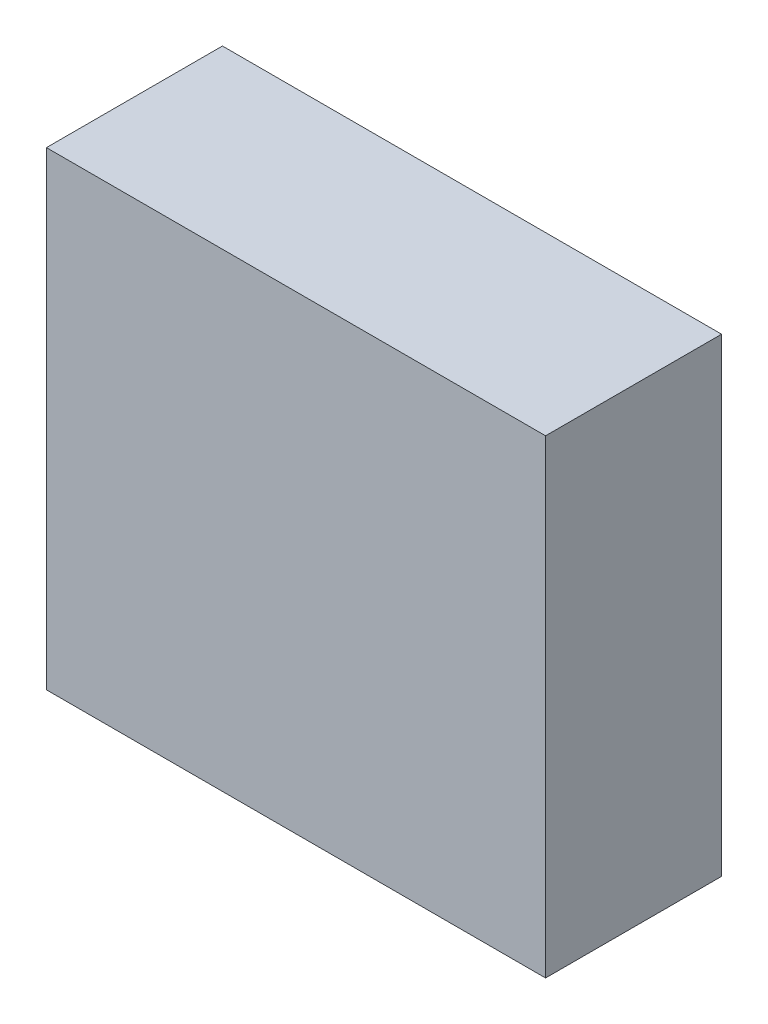
ISO-10303-21;
HEADER;
FILE_DESCRIPTION(('STEP AP214'),'2;1');
FILE_NAME('part.step','',(''),(''),'','','');
FILE_SCHEMA(('AUTOMOTIVE_DESIGN { 1 0 10303 214 1 1 1 1 }'));
ENDSEC;
DATA;
#1=APPLICATION_CONTEXT('core data for automotive mechanical design processes');
#2=APPLICATION_PROTOCOL_DEFINITION('international standard','automotive_design',2000,#1);
#3=PRODUCT_CONTEXT('',#1,'mechanical');
#4=PRODUCT('Part','Part','',(#3));
#5=PRODUCT_RELATED_PRODUCT_CATEGORY('part','',(#4));
#6=PRODUCT_DEFINITION_FORMATION('','',#4);
#7=PRODUCT_DEFINITION_CONTEXT('part definition',#1,'design');
#8=PRODUCT_DEFINITION('design','',#6,#7);
#9=PRODUCT_DEFINITION_SHAPE('','',#8);
#10=(LENGTH_UNIT() NAMED_UNIT(*) SI_UNIT(.MILLI.,.METRE.));
#11=(NAMED_UNIT(*) PLANE_ANGLE_UNIT() SI_UNIT($,.RADIAN.));
#12=(NAMED_UNIT(*) SI_UNIT($,.STERADIAN.) SOLID_ANGLE_UNIT());
#13=UNCERTAINTY_MEASURE_WITH_UNIT(LENGTH_MEASURE(1.E-05),#10,'distance_accuracy_value','');
#14=(GEOMETRIC_REPRESENTATION_CONTEXT(3) GLOBAL_UNCERTAINTY_ASSIGNED_CONTEXT((#13)) GLOBAL_UNIT_ASSIGNED_CONTEXT((#10,
#11,#12)) REPRESENTATION_CONTEXT('',''));
#15=CARTESIAN_POINT('',(0.,0.,0.));
#16=DIRECTION('',(0.,0.,1.));
#17=DIRECTION('',(1.,0.,0.));
#18=AXIS2_PLACEMENT_3D('',#15,#16,#17);
#19=CARTESIAN_POINT('',(-3.3749996,-3.175,2.38000032));
#20=DIRECTION('',(0.,0.,-1.));
#21=DIRECTION('',(-1.,0.,0.));
#22=AXIS2_PLACEMENT_3D('',#19,#20,#21);
#23=PLANE('',#22);
#24=DIRECTION('',(0.,1.,0.));
#25=VECTOR('',#24,1.);
#26=CARTESIAN_POINT('',(3.3749996,-3.175,2.38000032));
#27=LINE('',#26,#25);
#28=CARTESIAN_POINT('',(3.3749996,-3.175,2.38000032));
#29=VERTEX_POINT('',#28);
#30=CARTESIAN_POINT('',(3.3749996,3.17500254,2.38000032));
#31=VERTEX_POINT('',#30);
#32=EDGE_CURVE('E55',#29,#31,#27,.T.);
#33=ORIENTED_EDGE('',*,*,#32,.T.);
#34=DIRECTION('',(1.,0.,0.));
#35=VECTOR('',#34,1.);
#36=CARTESIAN_POINT('',(3.3749996,3.17500254,2.38000032));
#37=LINE('',#36,#35);
#38=CARTESIAN_POINT('',(-3.3749996,3.17500254,2.38000032));
#39=VERTEX_POINT('',#38);
#40=EDGE_CURVE('E57',#31,#39,#37,.F.);
#41=ORIENTED_EDGE('',*,*,#40,.T.);
#42=DIRECTION('',(0.,1.,0.));
#43=VECTOR('',#42,1.);
#44=CARTESIAN_POINT('',(-3.3749996,3.17500254,2.38000032));
#45=LINE('',#44,#43);
#46=CARTESIAN_POINT('',(-3.3749996,-3.175,2.38000032));
#47=VERTEX_POINT('',#46);
#48=EDGE_CURVE('E20',#39,#47,#45,.F.);
#49=ORIENTED_EDGE('',*,*,#48,.T.);
#50=DIRECTION('',(1.,0.,0.));
#51=VECTOR('',#50,1.);
#52=CARTESIAN_POINT('',(-3.3749996,-3.175,2.38000032));
#53=LINE('',#52,#51);
#54=EDGE_CURVE('E80',#47,#29,#53,.T.);
#55=ORIENTED_EDGE('',*,*,#54,.T.);
#56=EDGE_LOOP('',(#33,#41,#49,#55));
#57=FACE_BOUND('',#56,.T.);
#58=ADVANCED_FACE('F17',(#57),#23,.F.);
#59=CARTESIAN_POINT('',(-3.3749996,3.17500254,0.));
#60=DIRECTION('',(1.,0.,0.));
#61=DIRECTION('',(0.,0.,-1.));
#62=AXIS2_PLACEMENT_3D('',#59,#60,#61);
#63=PLANE('',#62);
#64=DIRECTION('',(0.,0.,1.));
#65=VECTOR('',#64,1.);
#66=CARTESIAN_POINT('',(-3.3749996,-3.175,0.));
#67=LINE('',#66,#65);
#68=CARTESIAN_POINT('',(-3.3749996,-3.175,0.));
#69=VERTEX_POINT('',#68);
#70=EDGE_CURVE('E68',#69,#47,#67,.T.);
#71=ORIENTED_EDGE('',*,*,#70,.T.);
#72=ORIENTED_EDGE('',*,*,#48,.F.);
#73=DIRECTION('',(0.,0.,-1.));
#74=VECTOR('',#73,1.);
#75=CARTESIAN_POINT('',(-3.3749996,3.17500254,0.));
#76=LINE('',#75,#74);
#77=CARTESIAN_POINT('',(-3.3749996,3.17500254,0.));
#78=VERTEX_POINT('',#77);
#79=EDGE_CURVE('E63',#39,#78,#76,.T.);
#80=ORIENTED_EDGE('',*,*,#79,.T.);
#81=DIRECTION('',(0.,1.,0.));
#82=VECTOR('',#81,1.);
#83=CARTESIAN_POINT('',(-3.3749996,-3.175,0.));
#84=LINE('',#83,#82);
#85=EDGE_CURVE('E83',#69,#78,#84,.T.);
#86=ORIENTED_EDGE('',*,*,#85,.F.);
#87=EDGE_LOOP('',(#71,#72,#80,#86));
#88=FACE_BOUND('',#87,.T.);
#89=ADVANCED_FACE('F65',(#88),#63,.F.);
#90=CARTESIAN_POINT('',(3.3749996,3.17500254,0.));
#91=DIRECTION('',(0.,-1.,0.));
#92=DIRECTION('',(0.,0.,-1.));
#93=AXIS2_PLACEMENT_3D('',#90,#91,#92);
#94=PLANE('',#93);
#95=ORIENTED_EDGE('',*,*,#79,.F.);
#96=ORIENTED_EDGE('',*,*,#40,.F.);
#97=DIRECTION('',(0.,0.,1.));
#98=VECTOR('',#97,1.);
#99=CARTESIAN_POINT('',(3.3749996,3.17500254,0.));
#100=LINE('',#99,#98);
#101=CARTESIAN_POINT('',(3.3749996,3.17500254,0.));
#102=VERTEX_POINT('',#101);
#103=EDGE_CURVE('E75',#31,#102,#100,.F.);
#104=ORIENTED_EDGE('',*,*,#103,.T.);
#105=DIRECTION('',(-1.,0.,0.));
#106=VECTOR('',#105,1.);
#107=CARTESIAN_POINT('',(-3.3749996,3.17500254,0.));
#108=LINE('',#107,#106);
#109=EDGE_CURVE('E72',#78,#102,#108,.F.);
#110=ORIENTED_EDGE('',*,*,#109,.F.);
#111=EDGE_LOOP('',(#95,#96,#104,#110));
#112=FACE_BOUND('',#111,.T.);
#113=ADVANCED_FACE('F70',(#112),#94,.F.);
#114=CARTESIAN_POINT('',(3.3749996,-3.175,0.));
#115=DIRECTION('',(-1.,0.,0.));
#116=DIRECTION('',(0.,0.,1.));
#117=AXIS2_PLACEMENT_3D('',#114,#115,#116);
#118=PLANE('',#117);
#119=ORIENTED_EDGE('',*,*,#103,.F.);
#120=ORIENTED_EDGE('',*,*,#32,.F.);
#121=DIRECTION('',(0.,0.,1.));
#122=VECTOR('',#121,1.);
#123=CARTESIAN_POINT('',(3.3749996,-3.175,0.));
#124=LINE('',#123,#122);
#125=CARTESIAN_POINT('',(3.3749996,-3.175,0.));
#126=VERTEX_POINT('',#125);
#127=EDGE_CURVE('E35',#29,#126,#124,.F.);
#128=ORIENTED_EDGE('',*,*,#127,.T.);
#129=DIRECTION('',(0.,1.,0.));
#130=VECTOR('',#129,1.);
#131=CARTESIAN_POINT('',(3.3749996,-3.175,0.));
#132=LINE('',#131,#130);
#133=EDGE_CURVE('E26',#102,#126,#132,.F.);
#134=ORIENTED_EDGE('',*,*,#133,.F.);
#135=EDGE_LOOP('',(#119,#120,#128,#134));
#136=FACE_BOUND('',#135,.T.);
#137=ADVANCED_FACE('F89',(#136),#118,.F.);
#138=CARTESIAN_POINT('',(-3.3749996,-3.175,0.));
#139=DIRECTION('',(0.,1.,0.));
#140=DIRECTION('',(0.,0.,1.));
#141=AXIS2_PLACEMENT_3D('',#138,#139,#140);
#142=PLANE('',#141);
#143=ORIENTED_EDGE('',*,*,#127,.F.);
#144=ORIENTED_EDGE('',*,*,#54,.F.);
#145=ORIENTED_EDGE('',*,*,#70,.F.);
#146=DIRECTION('',(-1.,0.,0.));
#147=VECTOR('',#146,1.);
#148=CARTESIAN_POINT('',(-3.3749996,-3.175,0.));
#149=LINE('',#148,#147);
#150=EDGE_CURVE('E11',#126,#69,#149,.T.);
#151=ORIENTED_EDGE('',*,*,#150,.F.);
#152=EDGE_LOOP('',(#143,#144,#145,#151));
#153=FACE_BOUND('',#152,.T.);
#154=ADVANCED_FACE('F91',(#153),#142,.F.);
#155=CARTESIAN_POINT('',(-3.3749996,-3.175,0.));
#156=DIRECTION('',(0.,0.,-1.));
#157=DIRECTION('',(-1.,0.,0.));
#158=AXIS2_PLACEMENT_3D('',#155,#156,#157);
#159=PLANE('',#158);
#160=ORIENTED_EDGE('',*,*,#133,.T.);
#161=ORIENTED_EDGE('',*,*,#150,.T.);
#162=ORIENTED_EDGE('',*,*,#85,.T.);
#163=ORIENTED_EDGE('',*,*,#109,.T.);
#164=EDGE_LOOP('',(#160,#161,#162,#163));
#165=FACE_BOUND('',#164,.T.);
#166=ADVANCED_FACE('F88',(#165),#159,.T.);
#167=CLOSED_SHELL('',(#58,#89,#113,#137,#154,#166));
#168=MANIFOLD_SOLID_BREP('B1',#167);
#169=ADVANCED_BREP_SHAPE_REPRESENTATION('',(#18,#168),#14);
#170=SHAPE_DEFINITION_REPRESENTATION(#9,#169);
ENDSEC;
END-ISO-10303-21;
